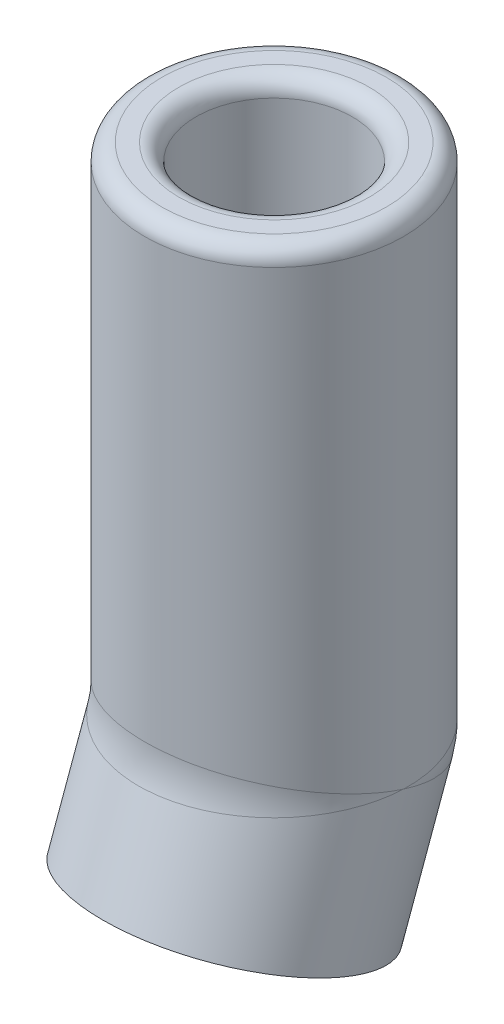
ISO-10303-21;
HEADER;
FILE_DESCRIPTION(('STEP AP214'),'2;1');
FILE_NAME('part.step','',(''),(''),'','','');
FILE_SCHEMA(('AUTOMOTIVE_DESIGN { 1 0 10303 214 1 1 1 1 }'));
ENDSEC;
DATA;
#1=APPLICATION_CONTEXT('core data for automotive mechanical design processes');
#2=APPLICATION_PROTOCOL_DEFINITION('international standard','automotive_design',2000,#1);
#3=PRODUCT_CONTEXT('',#1,'mechanical');
#4=PRODUCT('Part','Part','',(#3));
#5=PRODUCT_RELATED_PRODUCT_CATEGORY('part','',(#4));
#6=PRODUCT_DEFINITION_FORMATION('','',#4);
#7=PRODUCT_DEFINITION_CONTEXT('part definition',#1,'design');
#8=PRODUCT_DEFINITION('design','',#6,#7);
#9=PRODUCT_DEFINITION_SHAPE('','',#8);
#10=(LENGTH_UNIT() NAMED_UNIT(*) SI_UNIT(.MILLI.,.METRE.));
#11=(NAMED_UNIT(*) PLANE_ANGLE_UNIT() SI_UNIT($,.RADIAN.));
#12=(NAMED_UNIT(*) SI_UNIT($,.STERADIAN.) SOLID_ANGLE_UNIT());
#13=UNCERTAINTY_MEASURE_WITH_UNIT(LENGTH_MEASURE(1.E-05),#10,'distance_accuracy_value','');
#14=(GEOMETRIC_REPRESENTATION_CONTEXT(3) GLOBAL_UNCERTAINTY_ASSIGNED_CONTEXT((#13)) GLOBAL_UNIT_ASSIGNED_CONTEXT((#10,
#11,#12)) REPRESENTATION_CONTEXT('',''));
#15=CARTESIAN_POINT('',(0.,0.,0.));
#16=DIRECTION('',(0.,0.,1.));
#17=DIRECTION('',(1.,0.,0.));
#18=AXIS2_PLACEMENT_3D('',#15,#16,#17);
#19=CARTESIAN_POINT('',(0.,25.,0.));
#20=DIRECTION('',(0.,1.,0.));
#21=DIRECTION('',(0.,0.,1.));
#22=AXIS2_PLACEMENT_3D('',#19,#20,#21);
#23=PLANE('',#22);
#24=CARTESIAN_POINT('',(0.,25.,0.));
#25=DIRECTION('',(0.,1.,0.));
#26=DIRECTION('',(0.,0.,1.));
#27=AXIS2_PLACEMENT_3D('',#24,#25,#26);
#28=CIRCLE('',#27,5.575);
#29=CARTESIAN_POINT('',(0.,25.,5.575));
#30=VERTEX_POINT('',#29);
#31=EDGE_CURVE('E11',#30,#30,#28,.F.);
#32=ORIENTED_EDGE('',*,*,#31,.T.);
#33=EDGE_LOOP('',(#32));
#34=FACE_BOUND('',#33,.T.);
#35=CARTESIAN_POINT('',(0.,25.,0.));
#36=DIRECTION('',(0.,1.,0.));
#37=DIRECTION('',(0.,0.,1.));
#38=AXIS2_PLACEMENT_3D('',#35,#36,#37);
#39=CIRCLE('',#38,6.575);
#40=CARTESIAN_POINT('',(0.,25.,6.575));
#41=VERTEX_POINT('',#40);
#42=EDGE_CURVE('E75',#41,#41,#39,.T.);
#43=ORIENTED_EDGE('',*,*,#42,.T.);
#44=EDGE_LOOP('',(#43));
#45=FACE_BOUND('',#44,.T.);
#46=ADVANCED_FACE('F34',(#34,#45),#23,.T.);
#47=CARTESIAN_POINT('',(0.,25.,0.));
#48=DIRECTION('',(0.,-1.,0.));
#49=DIRECTION('',(0.,0.,-1.));
#50=AXIS2_PLACEMENT_3D('',#47,#48,#49);
#51=CYLINDRICAL_SURFACE('',#50,7.575);
#52=CARTESIAN_POINT('',(0.,24.,0.));
#53=DIRECTION('',(0.,1.,0.));
#54=DIRECTION('',(0.,0.,1.));
#55=AXIS2_PLACEMENT_3D('',#52,#53,#54);
#56=CIRCLE('',#55,7.575);
#57=CARTESIAN_POINT('',(0.,24.,7.575));
#58=VERTEX_POINT('',#57);
#59=EDGE_CURVE('E120',#58,#58,#56,.F.);
#60=ORIENTED_EDGE('',*,*,#59,.T.);
#61=EDGE_LOOP('',(#60));
#62=FACE_BOUND('',#61,.T.);
#63=CARTESIAN_POINT('',(0.,-4.,0.));
#64=DIRECTION('',(0.,0.953527218507654,-0.30130689266105));
#65=DIRECTION('',(0.,0.30130689266105,0.953527218507654));
#66=AXIS2_PLACEMENT_3D('',#63,#64,#65);
#67=ELLIPSE('',#66,7.94418853806343,7.575);
#68=CARTESIAN_POINT('',(-7.575,-4.,0.));
#69=VERTEX_POINT('',#68);
#70=CARTESIAN_POINT('',(7.575,-4.,0.));
#71=VERTEX_POINT('',#70);
#72=EDGE_CURVE('E48',#69,#71,#67,.T.);
#73=ORIENTED_EDGE('',*,*,#72,.T.);
#74=CARTESIAN_POINT('',(0.,-4.,0.));
#75=DIRECTION('',(0.,0.999328623934584,-0.0366374314739859));
#76=DIRECTION('',(0.,0.0366374314739859,0.999328623934584));
#77=AXIS2_PLACEMENT_3D('',#74,#75,#76);
#78=ELLIPSE('',#77,7.58008909038901,7.575);
#79=EDGE_CURVE('E54',#71,#69,#78,.T.);
#80=ORIENTED_EDGE('',*,*,#79,.T.);
#81=EDGE_LOOP('',(#73,#80));
#82=FACE_BOUND('',#81,.T.);
#83=ADVANCED_FACE('F90',(#62,#82),#51,.T.);
#84=CARTESIAN_POINT('',(0.,25.,0.));
#85=DIRECTION('',(0.,-1.,0.));
#86=DIRECTION('',(0.,0.,-1.));
#87=AXIS2_PLACEMENT_3D('',#84,#85,#86);
#88=CYLINDRICAL_SURFACE('',#87,4.575);
#89=CARTESIAN_POINT('',(0.,24.,0.));
#90=DIRECTION('',(0.,1.,0.));
#91=DIRECTION('',(0.,0.,1.));
#92=AXIS2_PLACEMENT_3D('',#89,#90,#91);
#93=CIRCLE('',#92,4.575);
#94=CARTESIAN_POINT('',(0.,24.,4.575));
#95=VERTEX_POINT('',#94);
#96=EDGE_CURVE('E42',#95,#95,#93,.T.);
#97=ORIENTED_EDGE('',*,*,#96,.T.);
#98=EDGE_LOOP('',(#97));
#99=FACE_BOUND('',#98,.T.);
#100=CARTESIAN_POINT('',(0.,0.,0.));
#101=DIRECTION('',(0.,1.,0.));
#102=DIRECTION('',(0.,0.,1.));
#103=AXIS2_PLACEMENT_3D('',#100,#101,#102);
#104=CIRCLE('',#103,4.575);
#105=CARTESIAN_POINT('',(0.,0.,4.575));
#106=VERTEX_POINT('',#105);
#107=EDGE_CURVE('E62',#106,#106,#104,.T.);
#108=ORIENTED_EDGE('',*,*,#107,.F.);
#109=EDGE_LOOP('',(#108));
#110=FACE_BOUND('',#109,.T.);
#111=ADVANCED_FACE('F103',(#99,#110),#88,.F.);
#112=CARTESIAN_POINT('',(0.,0.,0.));
#113=DIRECTION('',(0.,1.,0.));
#114=DIRECTION('',(0.,0.,1.));
#115=AXIS2_PLACEMENT_3D('',#112,#113,#114);
#116=PLANE('',#115);
#117=ORIENTED_EDGE('',*,*,#107,.T.);
#118=EDGE_LOOP('',(#117));
#119=FACE_BOUND('',#118,.T.);
#120=ADVANCED_FACE('F99',(#119),#116,.T.);
#121=CARTESIAN_POINT('',(0.,-12.,2.91176187412963));
#122=DIRECTION('',(0.,0.939692620785908,-0.34202014332567));
#123=DIRECTION('',(0.,0.34202014332567,0.939692620785908));
#124=AXIS2_PLACEMENT_3D('',#121,#122,#123);
#125=PLANE('',#124);
#126=CARTESIAN_POINT('',(0.,-12.,2.91176187412963));
#127=DIRECTION('',(0.,0.939692620785908,-0.34202014332567));
#128=DIRECTION('',(0.,0.34202014332567,0.939692620785908));
#129=AXIS2_PLACEMENT_3D('',#126,#127,#128);
#130=CIRCLE('',#129,7.575);
#131=CARTESIAN_POINT('',(0.,-9.40919741430805,10.0299334765829));
#132=VERTEX_POINT('',#131);
#133=EDGE_CURVE('E59',#132,#132,#130,.T.);
#134=ORIENTED_EDGE('',*,*,#133,.F.);
#135=EDGE_LOOP('',(#134));
#136=FACE_BOUND('',#135,.T.);
#137=ADVANCED_FACE('F89',(#136),#125,.F.);
#138=CARTESIAN_POINT('',(0.,-2.52539246041355,-0.536713251633989));
#139=DIRECTION('',(0.,-0.939692620785908,0.34202014332567));
#140=DIRECTION('',(0.,-0.34202014332567,-0.939692620785908));
#141=AXIS2_PLACEMENT_3D('',#138,#139,#140);
#142=CYLINDRICAL_SURFACE('',#141,7.575);
#143=CARTESIAN_POINT('',(0.,-4.,0.));
#144=DIRECTION('',(0.,0.951592473215281,-0.307362595186897));
#145=DIRECTION('',(0.,0.307362595186897,0.951592473215281));
#146=AXIS2_PLACEMENT_3D('',#143,#144,#145);
#147=ELLIPSE('',#146,7.58008909038901,7.575);
#148=EDGE_CURVE('E65',#69,#71,#147,.F.);
#149=ORIENTED_EDGE('',*,*,#148,.T.);
#150=CARTESIAN_POINT('',(0.,-4.,0.));
#151=DIRECTION('',(0.,0.999075517563099,-0.0429896523133944));
#152=DIRECTION('',(0.,0.0429896523133944,0.999075517563099));
#153=AXIS2_PLACEMENT_3D('',#150,#151,#152);
#154=ELLIPSE('',#153,7.94418853806343,7.575);
#155=EDGE_CURVE('E70',#71,#69,#154,.F.);
#156=ORIENTED_EDGE('',*,*,#155,.T.);
#157=EDGE_LOOP('',(#149,#156));
#158=FACE_BOUND('',#157,.T.);
#159=ORIENTED_EDGE('',*,*,#133,.T.);
#160=EDGE_LOOP('',(#159));
#161=FACE_BOUND('',#160,.T.);
#162=ADVANCED_FACE('F60',(#158,#161),#142,.T.);
#163=CARTESIAN_POINT('',(7.575,-4.,0.));
#164=CARTESIAN_POINT('',(7.575,-4.,0.));
#165=CARTESIAN_POINT('',(7.575,-4.,0.));
#166=CARTESIAN_POINT('',(7.57499888047834,-3.99254845607747,0.173173187046285));
#167=CARTESIAN_POINT('',(7.57500258805971,-3.97016092227507,0.169225819015982));
#168=CARTESIAN_POINT('',(7.57499888047834,-3.94777344258388,0.165278144105769));
#169=CARTESIAN_POINT('',(7.56958879430556,-3.98509901267392,0.34629755822542));
#170=CARTESIAN_POINT('',(7.56932976715222,-3.94032906793487,0.338410672181107));
#171=CARTESIAN_POINT('',(7.56958879430556,-3.89556160733533,0.330509697881582));
#172=CARTESIAN_POINT('',(7.54797794298695,-3.97023109430699,0.691826596916192));
#173=CARTESIAN_POINT('',(7.54669149111669,-3.88080903868768,0.675965531953642));
#174=CARTESIAN_POINT('',(7.54797794298695,-3.79135498917492,0.660285913377355));
#175=CARTESIAN_POINT('',(7.5317772402684,-3.9628126191647,0.864231268585723));
#176=CARTESIAN_POINT('',(7.52972416590204,-3.85111833677837,0.844349869903385));
#177=CARTESIAN_POINT('',(7.5317772402684,-3.73936020500911,0.824830579065649));
#178=CARTESIAN_POINT('',(7.46707427229843,-3.94065882772718,1.37908331914458));
#179=CARTESIAN_POINT('',(7.46199818780777,-3.76250100519663,1.34692373140557));
#180=CARTESIAN_POINT('',(7.46707427229843,-3.5840881872216,1.31621029469496));
#181=CARTESIAN_POINT('',(7.40247101058536,-3.92600974851794,1.71952655618521));
#182=CARTESIAN_POINT('',(7.39440259875741,-3.70396795867191,1.67888113400822));
#183=CARTESIAN_POINT('',(7.40247101058536,-3.481415374129,1.64113257250924));
#184=CARTESIAN_POINT('',(7.23138960627717,-3.89722176970849,2.38855650364788));
#185=CARTESIAN_POINT('',(7.21594240774403,-3.58921516826734,2.32967654798018));
#186=CARTESIAN_POINT('',(7.23138960627717,-3.27964550686328,2.27966114586317));
#187=CARTESIAN_POINT('',(7.12495279738831,-3.88308238151616,2.71715456890518));
#188=CARTESIAN_POINT('',(7.10506499158719,-3.53297733418534,2.6486171539841));
#189=CARTESIAN_POINT('',(7.12495279738831,-3.18054502823418,2.59327827856605));
#190=CARTESIAN_POINT('',(6.87199891375851,-3.85555037425999,3.3569958543959));
#191=CARTESIAN_POINT('',(6.84259641823819,-3.42383206405642,3.26761074016343));
#192=CARTESIAN_POINT('',(6.87199891375851,-2.98757804411899,3.20394891408365));
#193=CARTESIAN_POINT('',(6.725538033073,-3.84215673965581,3.66826267569223));
#194=CARTESIAN_POINT('',(6.69099141614657,-3.37090948481809,3.56774960164508));
#195=CARTESIAN_POINT('',(6.725538033073,-2.89370442088975,3.50102494197827));
#196=CARTESIAN_POINT('',(6.39503062930193,-3.81634751864779,4.26806656916211));
#197=CARTESIAN_POINT('',(6.350453747194,-3.26933472489361,4.14380869093684));
#198=CARTESIAN_POINT('',(6.39503062930193,-2.71281214180736,4.07348350805886));
#199=CARTESIAN_POINT('',(6.21104902897303,-3.80393029348706,4.55664172589337));
#200=CARTESIAN_POINT('',(6.16151176284947,-3.22067099957615,4.41979439160459));
#201=CARTESIAN_POINT('',(6.21104902897303,-2.62578200019609,4.34890239451054));
#202=CARTESIAN_POINT('',(5.80864087439418,-3.78028657951736,5.10611943739437));
#203=CARTESIAN_POINT('',(5.75033455111506,-3.12841825399868,4.94298571040794));
#204=CARTESIAN_POINT('',(5.80864087439418,-2.46006737809956,4.87332917173502));
#205=CARTESIAN_POINT('',(5.59028115272261,-3.76905784961791,5.3670740748986));
#206=CARTESIAN_POINT('',(5.52810059165778,-3.08482152922559,5.1902350230084));
#207=CARTESIAN_POINT('',(5.59028115272261,-2.38136719020618,5.12238677076719));
#208=CARTESIAN_POINT('',(5.12285355396729,-3.74798395327803,5.85682946392453));
#209=CARTESIAN_POINT('',(5.05483425638177,-3.00337004385396,5.65216935117739));
#210=CARTESIAN_POINT('',(5.12285355396729,-2.2336639667388,5.58981399287159));
#211=CARTESIAN_POINT('',(4.87384784205608,-3.73813606990637,6.08569335667505));
#212=CARTESIAN_POINT('',(4.80381931329707,-2.96551120330485,5.86687750529538));
#213=CARTESIAN_POINT('',(4.87384784205608,-2.1646418886729,5.80824387853581));
#214=CARTESIAN_POINT('',(4.34939589076599,-3.71999276863845,6.50734198905772));
#215=CARTESIAN_POINT('',(4.27775865631388,-2.89606211761869,6.26074284233635));
#216=CARTESIAN_POINT('',(4.34939589076599,-2.03747868931047,6.21066936145033));
#217=CARTESIAN_POINT('',(4.07400176540466,-3.7116943825297,6.70019570967185));
#218=CARTESIAN_POINT('',(4.00275068911941,-2.86447079732678,6.43990612276558));
#219=CARTESIAN_POINT('',(4.07400176540466,-1.97931676433596,6.39473079480882));
#220=CARTESIAN_POINT('',(3.50149734168551,-3.69679224911782,7.04651990282262));
#221=CARTESIAN_POINT('',(3.43358242764209,-2.8079519489975,6.76044043976119));
#222=CARTESIAN_POINT('',(3.50149734168551,-1.8748703389585,6.72526591331762));
#223=CARTESIAN_POINT('',(3.20442571026539,-3.6901855748137,7.20005839858991));
#224=CARTESIAN_POINT('',(3.13948211612153,-2.78302543130898,6.90180574635445));
#225=CARTESIAN_POINT('',(3.20442571026539,-1.82856532372168,6.87180452048912));
#226=CARTESIAN_POINT('',(2.59366442246287,-3.67877976840643,7.46512827765048));
#227=CARTESIAN_POINT('',(2.53699896151311,-2.74011513914118,7.14516210620017));
#228=CARTESIAN_POINT('',(2.59366442246287,-1.74862403780909,7.12478974537711));
#229=CARTESIAN_POINT('',(2.27999908739741,-3.67397807014202,7.57671929829256));
#230=CARTESIAN_POINT('',(2.22869754053759,-2.72213339899897,7.24714162215379));
#231=CARTESIAN_POINT('',(2.27999908739741,-1.71496978136154,7.23129328154904));
#232=CARTESIAN_POINT('',(1.64143266568392,-3.66626390888283,7.7559956877922));
#233=CARTESIAN_POINT('',(1.60260785167663,-2.69329399138388,7.4106980302498));
#234=CARTESIAN_POINT('',(1.64143266568392,-1.66090258534078,7.40239638038249));
#235=CARTESIAN_POINT('',(1.31654326868554,-3.66334953924308,7.82372536690133));
#236=CARTESIAN_POINT('',(1.28491884763783,-2.68243836129969,7.47226336778674));
#237=CARTESIAN_POINT('',(1.31654326868554,-1.64047628242918,7.46703823317143));
#238=CARTESIAN_POINT('',(0.661100540295204,-3.6594591413318,7.91413785217591));
#239=CARTESIAN_POINT('',(0.64476504614048,-2.66795230677787,7.55441786543433));
#240=CARTESIAN_POINT('',(0.661100540295204,-1.61320916946629,7.55332877286209));
#241=CARTESIAN_POINT('',(0.330550270147602,-3.6584820968366,7.93684427528455));
#242=CARTESIAN_POINT('',(0.322411325383715,-2.66432312113337,7.575));
#243=CARTESIAN_POINT('',(0.330550270147602,-1.60636123688258,7.575));
#244=CARTESIAN_POINT('',(-0.330550270147602,-3.6584820968366,7.93684427528455));
#245=CARTESIAN_POINT('',(-0.322411325383714,-2.66432312113337,7.575));
#246=CARTESIAN_POINT('',(-0.330550270147602,-1.60636123688258,7.575));
#247=CARTESIAN_POINT('',(-0.661100540295203,-3.6594591413318,7.91413785217591));
#248=CARTESIAN_POINT('',(-0.644765046140479,-2.66795230677787,7.55441786543433));
#249=CARTESIAN_POINT('',(-0.661100540295203,-1.61320916946629,7.55332877286209));
#250=CARTESIAN_POINT('',(-1.31654326868554,-3.66334953924308,7.82372536690133));
#251=CARTESIAN_POINT('',(-1.28491884763782,-2.68243836129969,7.47226336778674));
#252=CARTESIAN_POINT('',(-1.31654326868554,-1.64047628242918,7.46703823317144));
#253=CARTESIAN_POINT('',(-1.64143266568391,-3.66626390888283,7.7559956877922));
#254=CARTESIAN_POINT('',(-1.60260785167662,-2.69329399138388,7.4106980302498));
#255=CARTESIAN_POINT('',(-1.64143266568391,-1.66090258534078,7.40239638038249));
#256=CARTESIAN_POINT('',(-2.27999908739741,-3.67397807014202,7.57671929829256));
#257=CARTESIAN_POINT('',(-2.22869754053758,-2.72213339899897,7.24714162215379));
#258=CARTESIAN_POINT('',(-2.27999908739741,-1.71496978136154,7.23129328154904));
#259=CARTESIAN_POINT('',(-2.59366442246287,-3.67877976840643,7.46512827765048));
#260=CARTESIAN_POINT('',(-2.53699896151311,-2.74011513914118,7.14516210620017));
#261=CARTESIAN_POINT('',(-2.59366442246287,-1.74862403780909,7.12478974537711));
#262=CARTESIAN_POINT('',(-3.20442571026539,-3.6901855748137,7.20005839858991));
#263=CARTESIAN_POINT('',(-3.13948211612153,-2.78302543130898,6.90180574635445));
#264=CARTESIAN_POINT('',(-3.20442571026539,-1.82856532372168,6.87180452048912));
#265=CARTESIAN_POINT('',(-3.50149734168551,-3.69679224911782,7.04651990282262));
#266=CARTESIAN_POINT('',(-3.43358242764209,-2.8079519489975,6.76044043976119));
#267=CARTESIAN_POINT('',(-3.50149734168551,-1.8748703389585,6.72526591331763));
#268=CARTESIAN_POINT('',(-4.07400176540466,-3.7116943825297,6.70019570967185));
#269=CARTESIAN_POINT('',(-4.00275068911941,-2.86447079732678,6.43990612276558));
#270=CARTESIAN_POINT('',(-4.07400176540466,-1.97931676433596,6.39473079480883));
#271=CARTESIAN_POINT('',(-4.34939589076599,-3.71999276863846,6.50734198905772));
#272=CARTESIAN_POINT('',(-4.27775865631388,-2.89606211761869,6.26074284233635));
#273=CARTESIAN_POINT('',(-4.34939589076599,-2.03747868931046,6.21066936145033));
#274=CARTESIAN_POINT('',(-4.87384784205608,-3.73813606990637,6.08569335667505));
#275=CARTESIAN_POINT('',(-4.80381931329707,-2.96551120330485,5.86687750529539));
#276=CARTESIAN_POINT('',(-4.87384784205608,-2.1646418886729,5.80824387853581));
#277=CARTESIAN_POINT('',(-5.12285355396729,-3.74798395327803,5.85682946392453));
#278=CARTESIAN_POINT('',(-5.05483425638177,-3.00337004385396,5.65216935117739));
#279=CARTESIAN_POINT('',(-5.12285355396729,-2.2336639667388,5.58981399287159));
#280=CARTESIAN_POINT('',(-5.5902811527226,-3.76905784961791,5.3670740748986));
#281=CARTESIAN_POINT('',(-5.52810059165778,-3.08482152922559,5.1902350230084));
#282=CARTESIAN_POINT('',(-5.5902811527226,-2.38136719020617,5.12238677076719));
#283=CARTESIAN_POINT('',(-5.80864087439417,-3.78028657951736,5.10611943739437));
#284=CARTESIAN_POINT('',(-5.75033455111506,-3.12841825399868,4.94298571040795));
#285=CARTESIAN_POINT('',(-5.80864087439417,-2.46006737809955,4.87332917173503));
#286=CARTESIAN_POINT('',(-6.21104902897303,-3.80393029348706,4.55664172589337));
#287=CARTESIAN_POINT('',(-6.16151176284946,-3.22067099957615,4.41979439160459));
#288=CARTESIAN_POINT('',(-6.21104902897303,-2.62578200019609,4.34890239451054));
#289=CARTESIAN_POINT('',(-6.39503062930193,-3.81634751864779,4.26806656916211));
#290=CARTESIAN_POINT('',(-6.35045374719399,-3.26933472489361,4.14380869093685));
#291=CARTESIAN_POINT('',(-6.39503062930193,-2.71281214180736,4.07348350805886));
#292=CARTESIAN_POINT('',(-6.725538033073,-3.84215673965582,3.66826267569224));
#293=CARTESIAN_POINT('',(-6.69099141614657,-3.37090948481809,3.56774960164508));
#294=CARTESIAN_POINT('',(-6.725538033073,-2.89370442088975,3.50102494197827));
#295=CARTESIAN_POINT('',(-6.87199891375851,-3.85555037426,3.3569958543959));
#296=CARTESIAN_POINT('',(-6.84259641823819,-3.42383206405643,3.26761074016343));
#297=CARTESIAN_POINT('',(-6.87199891375851,-2.987578044119,3.20394891408365));
#298=CARTESIAN_POINT('',(-7.12495279738831,-3.88308238151616,2.71715456890519));
#299=CARTESIAN_POINT('',(-7.10506499158718,-3.53297733418533,2.6486171539841));
#300=CARTESIAN_POINT('',(-7.12495279738831,-3.18054502823417,2.59327827856606));
#301=CARTESIAN_POINT('',(-7.23138960627716,-3.89722176970848,2.38855650364788));
#302=CARTESIAN_POINT('',(-7.21594240774403,-3.58921516826733,2.32967654798018));
#303=CARTESIAN_POINT('',(-7.23138960627716,-3.27964550686327,2.27966114586317));
#304=CARTESIAN_POINT('',(-7.40247101058536,-3.92600974851795,1.71952655618522));
#305=CARTESIAN_POINT('',(-7.39440259875741,-3.70396795867192,1.67888113400823));
#306=CARTESIAN_POINT('',(-7.40247101058536,-3.48141537412901,1.64113257250925));
#307=CARTESIAN_POINT('',(-7.46707427229843,-3.94065882772722,1.3790833191446));
#308=CARTESIAN_POINT('',(-7.46199818780777,-3.76250100519667,1.34692373140558));
#309=CARTESIAN_POINT('',(-7.46707427229843,-3.58408818722164,1.31621029469497));
#310=CARTESIAN_POINT('',(-7.5317772402684,-3.96281261916468,0.864231268585721));
#311=CARTESIAN_POINT('',(-7.52972416590203,-3.85111833677835,0.844349869903384));
#312=CARTESIAN_POINT('',(-7.5317772402684,-3.73936020500909,0.824830579065649));
#313=CARTESIAN_POINT('',(-7.54797794298695,-3.97023109430693,0.69182659691618));
#314=CARTESIAN_POINT('',(-7.54669149111669,-3.88080903868762,0.675965531953634));
#315=CARTESIAN_POINT('',(-7.54797794298695,-3.79135498917486,0.660285913377352));
#316=CARTESIAN_POINT('',(-7.56958879430556,-3.98509901267383,0.3462975582254));
#317=CARTESIAN_POINT('',(-7.56932976715222,-3.94032906793478,0.338410672181094));
#318=CARTESIAN_POINT('',(-7.56958879430556,-3.89556160733524,0.330509697881575));
#319=CARTESIAN_POINT('',(-7.57499888047834,-3.99254845607739,0.173173187046268));
#320=CARTESIAN_POINT('',(-7.57500258805971,-3.97016092227499,0.16922581901597));
#321=CARTESIAN_POINT('',(-7.57499888047834,-3.9477734425838,0.165278144105763));
#322=CARTESIAN_POINT('',(-7.575,-4.,0.));
#323=CARTESIAN_POINT('',(-7.575,-4.,0.));
#324=CARTESIAN_POINT('',(-7.575,-4.,0.));
#325=(BOUNDED_SURFACE() B_SPLINE_SURFACE(3,2,((#163,#164,#165),(#166,#167,#168),(#169,#170,
#171),(#172,#173,#174),(#175,#176,#177),(#178,#179,#180),(#181,#182,#183),(#184,#185,#186),
(#187,#188,#189),(#190,#191,#192),(#193,#194,#195),(#196,#197,#198),(#199,#200,#201),(#202,#203,
#204),(#205,#206,#207),(#208,#209,#210),(#211,#212,#213),(#214,#215,#216),(#217,#218,#219),
(#220,#221,#222),(#223,#224,#225),(#226,#227,#228),(#229,#230,#231),(#232,#233,#234),(#235,#236,
#237),(#238,#239,#240),(#241,#242,#243),(#244,#245,#246),(#247,#248,#249),(#250,#251,#252),
(#253,#254,#255),(#256,#257,#258),(#259,#260,#261),(#262,#263,#264),(#265,#266,#267),(#268,#269,
#270),(#271,#272,#273),(#274,#275,#276),(#277,#278,#279),(#280,#281,#282),(#283,#284,#285),
(#286,#287,#288),(#289,#290,#291),(#292,#293,#294),(#295,#296,#297),(#298,#299,#300),(#301,#302,
#303),(#304,#305,#306),(#307,#308,#309),(#310,#311,#312),(#313,#314,#315),(#316,#317,#318),
(#319,#320,#321),(#322,#323,#324)),.UNSPECIFIED.,.F.,.F.,.F.) B_SPLINE_SURFACE_WITH_KNOTS((4,2,
2,2,2,2,2,2,2,2,2,2,2,2,2,2,2,2,2,2,2,2,2,2,2,2,4),(3,3),(0.,0.901956910311366,1.80390860254944,
3.6059615583114,5.40623845068466,7.20400061479368,8.99867807780822,10.789908737092,
12.5775640009625,14.3617588952914,16.1428455912442,17.9213904256492,19.6981356977216,
21.4739487314751,23.2497617652285,25.0265070373009,26.8050518717059,28.5861385676587,
30.3703334619877,32.1579887258581,33.9492193851419,35.7438968481565,37.5416590122655,
39.3419359046387,41.1439888604007,42.0459405526388,42.9478974629501),(0.,1.),
.UNSPECIFIED.) GEOMETRIC_REPRESENTATION_ITEM() RATIONAL_B_SPLINE_SURFACE(((1.,1.,1.),(1.,
1.00000006701755,1.),(1.,0.999978450902769,1.),(1.,0.999892576529652,1.),(1.,0.999828318518011,
1.),(1.,0.999572842255244,1.),(1.,0.999318918854911,1.),(1.,0.998660470541519,1.),(1.,
0.998256094304618,1.),(1.,0.997323765861636,1.),(1.,0.996795987062458,1.),(1.,0.995652311813626,
1.),(1.,0.995036568115042,1.),(1.,0.993758596084939,1.),(1.,0.993096459301637,1.),(1.,
0.991770760016961,1.),(1.,0.991107202999509,1.),(1.,0.989824105067995,1.),(1.,0.989204481438143,
1.),(1.,0.988051926982961,1.),(1.,0.987518847012851,1.),(1.,0.986576267571039,1.),(1.,
0.986166592818301,1.),(1.,0.985499258773441,1.),(1.,0.98524144608887,1.),(1.,0.984895737749545,
1.),(1.,0.984807753012208,1.),(1.,0.984807753012208,1.),(1.,0.984895737749545,1.),(1.,
0.985241446088869,1.),(1.,0.985499258773442,1.),(1.,0.986166592818301,1.),(1.,0.986576267571039,
1.),(1.,0.987518847012851,1.),(1.,0.98805192698296,1.),(1.,0.989204481438143,1.),(1.,
0.989824105067995,1.),(1.,0.991107202999509,1.),(1.,0.991770760016961,1.),(1.,0.993096459301637,
1.),(1.,0.993758596084939,1.),(1.,0.995036568115043,1.),(1.,0.995652311813626,1.),(1.,
0.996795987062458,1.),(1.,0.997323765861636,1.),(1.,0.998256094304618,1.),(1.,0.998660470541519,
1.),(1.,0.999318918854912,1.),(1.,0.999572842255244,1.),(1.,0.999828318518011,1.),(1.,
0.999892576529652,1.),(1.,0.999978450902769,1.),(1.,1.00000006701755,1.),(1.,1.,1.))) REPRESENTATION_ITEM('') SURFACE());
#326=ORIENTED_EDGE('',*,*,#155,.F.);
#327=ORIENTED_EDGE('',*,*,#72,.F.);
#328=EDGE_LOOP('',(#326,#327));
#329=FACE_BOUND('',#328,.T.);
#330=ADVANCED_FACE('F81',(#329),#325,.F.);
#331=CARTESIAN_POINT('',(-7.575,-4.,0.));
#332=CARTESIAN_POINT('',(-7.575,-4.,0.));
#333=CARTESIAN_POINT('',(-7.575,-4.,0.));
#334=CARTESIAN_POINT('',(-7.57499888047834,-4.00605943483834,-0.165278144105766));
#335=CARTESIAN_POINT('',(-7.57499744183442,-4.02844693377994,-0.16133057837008));
#336=CARTESIAN_POINT('',(-7.57499888047834,-4.05083444833192,-0.157383101165255));
#337=CARTESIAN_POINT('',(-7.56958879430556,-4.01211716157989,-0.330509697881578));
#338=CARTESIAN_POINT('',(-7.56984734228634,-4.05688709949602,-0.322622773142559));
#339=CARTESIAN_POINT('',(-7.56958879430556,-4.10165456691848,-0.314721837537748));
#340=CARTESIAN_POINT('',(-7.54797794298695,-4.02420743219518,-0.660285913377355));
#341=CARTESIAN_POINT('',(-7.54926301805584,-4.11366399817617,-0.644620566401564));
#342=CARTESIAN_POINT('',(-7.54797794298695,-4.20308353732725,-0.628745229838521));
#343=CARTESIAN_POINT('',(-7.5317772402684,-4.03023997621441,-0.824830579065652));
#344=CARTESIAN_POINT('',(-7.53382709167157,-4.14200314437274,-0.805339851009663));
#345=CARTESIAN_POINT('',(-7.5317772402684,-4.25369239037,-0.785429889545576));
#346=CARTESIAN_POINT('',(-7.46707427229843,-4.04825496170356,-1.31621029469497));
#347=CARTESIAN_POINT('',(-7.47213475577845,-4.22668723098142,-1.28560717180444));
#348=CARTESIAN_POINT('',(-7.46707427229843,-4.40482560220914,-1.25333727024533));
#349=CARTESIAN_POINT('',(-7.40247101058536,-4.06016727703475,-1.64113257250925));
#350=CARTESIAN_POINT('',(-7.41048212506948,-4.28275709501414,-1.60359517232164));
#351=CARTESIAN_POINT('',(-7.40247101058536,-4.50476165142369,-1.56273858883327));
#352=CARTESIAN_POINT('',(-7.23138960627716,-4.08357704064017,-2.27966114586317));
#353=CARTESIAN_POINT('',(-7.24678133967733,-4.39318367819222,-2.22985544590196));
#354=CARTESIAN_POINT('',(-7.23138960627717,-4.70115330348538,-2.17076578807845));
#355=CARTESIAN_POINT('',(-7.12495279738831,-4.09507488622697,-2.59327827856606));
#356=CARTESIAN_POINT('',(-7.14472166104233,-4.44755763786963,-2.53822549488108));
#357=CARTESIAN_POINT('',(-7.12495279738831,-4.79761223950896,-2.46940198822693));
#358=CARTESIAN_POINT('',(-6.87199891375851,-4.11746332084807,-3.20394891408365));
#359=CARTESIAN_POINT('',(-6.90128399264151,-4.55376750849578,-3.14057160322715));
#360=CARTESIAN_POINT('',(-6.87199891375851,-4.98543565098907,-3.05090197377139));
#361=CARTESIAN_POINT('',(-6.725538033073,-4.12835473569787,-3.50102494197827));
#362=CARTESIAN_POINT('',(-6.7598938829413,-4.60561782980314,-3.4346293877989));
#363=CARTESIAN_POINT('',(-6.725538033073,-5.07680705446393,-3.33378720826431));
#364=CARTESIAN_POINT('',(-6.39503062930193,-4.14934223769086,-4.07348350805886));
#365=CARTESIAN_POINT('',(-6.43941885216839,-4.70592267062317,-4.00348640796114));
#366=CARTESIAN_POINT('',(-6.39503062930193,-5.25287761453129,-3.87890044695561));
#367=CARTESIAN_POINT('',(-6.21104902897303,-4.15943965743581,-4.34890239451054));
#368=CARTESIAN_POINT('',(-6.26032662282199,-4.75438812314835,-4.27834764774676));
#369=CARTESIAN_POINT('',(-6.21104902897303,-5.33758795072677,-4.14116306312771));
#370=CARTESIAN_POINT('',(-5.80864087439417,-4.1786662158006,-4.87332917173503));
#371=CARTESIAN_POINT('',(-5.866689705678,-4.84707646598293,-4.80400936135502));
#372=CARTESIAN_POINT('',(-5.80864087439418,-5.49888541721841,-4.64053890607568));
#373=CARTESIAN_POINT('',(-5.5902811527226,-4.1877971768269,-5.1223867707672));
#374=CARTESIAN_POINT('',(-5.6521485113197,-4.89130655197085,-5.05485064389842));
#375=CARTESIAN_POINT('',(-5.59028115272261,-5.57548783623863,-4.87769946663578));
#376=CARTESIAN_POINT('',(-5.12285355396729,-4.20493401490875,-5.58981399287159));
#377=CARTESIAN_POINT('',(-5.19056166072777,-4.97469515306906,-5.52777090127007));
#378=CARTESIAN_POINT('',(-5.12285355396729,-5.71925400144798,-5.32279852181864));
#379=CARTESIAN_POINT('',(-4.87384784205608,-4.21294210131419,-5.80824387853581));
#380=CARTESIAN_POINT('',(-4.94353593004496,-5.01385731111581,-5.74987053621757));
#381=CARTESIAN_POINT('',(-4.87384784205608,-5.78643628254766,-5.53079440039657));
#382=CARTESIAN_POINT('',(-4.34939589076599,-4.22769584267668,-6.21066936145033));
#383=CARTESIAN_POINT('',(-4.42069416486756,-5.08632529883717,-6.16085691748604));
#384=CARTESIAN_POINT('',(-4.349395890766,-5.91020992200467,-5.91399673384294));
#385=CARTESIAN_POINT('',(-4.07400176540466,-4.23444391132013,-6.39473079480883));
#386=CARTESIAN_POINT('',(-4.14491879467707,-5.11963181099084,-6.34974753433802));
#387=CARTESIAN_POINT('',(-4.07400176540466,-5.96682152951387,-6.0892658799458));
#388=CARTESIAN_POINT('',(-3.5014973416855,-4.24656200487222,-6.72526591331763));
#389=CARTESIAN_POINT('',(-3.56907887028928,-5.17967769430028,-6.69028466069371));
#390=CARTESIAN_POINT('',(-3.50149734168551,-6.06848391503153,-6.40401192381263));
#391=CARTESIAN_POINT('',(-3.20442571026539,-4.25193440995494,-6.87180452048912));
#392=CARTESIAN_POINT('',(-3.26907783846258,-5.20641569612657,-6.84192340434407));
#393=CARTESIAN_POINT('',(-3.2044257102654,-6.11355466104696,-6.54355064238833));
#394=CARTESIAN_POINT('',(-2.59366442246287,-4.26120936577905,-7.12478974537711));
#395=CARTESIAN_POINT('',(-2.65003810404451,-5.25272188691422,-7.1045388622938));
#396=CARTESIAN_POINT('',(-2.59366442246287,-6.19136509637639,-6.78445121310374));
#397=CARTESIAN_POINT('',(-2.27999908739741,-4.26511400326744,-7.23129328154904));
#398=CARTESIAN_POINT('',(-2.33108512444289,-5.27228772807184,-7.21550226153656));
#399=CARTESIAN_POINT('',(-2.27999908739741,-6.22412229204792,-6.88586726480552));
#400=CARTESIAN_POINT('',(-1.64143266568392,-4.27138699286101,-7.40239638038249));
#401=CARTESIAN_POINT('',(-1.6800407287638,-5.30378871456272,-7.39415323352231));
#402=CARTESIAN_POINT('',(-1.64143266568392,-6.27674831640306,-7.04879707297279));
#403=CARTESIAN_POINT('',(-1.31654326868554,-4.27375689540877,-7.46703823317144));
#404=CARTESIAN_POINT('',(-1.3480536304797,-5.31572158390065,-7.46182789845438));
#405=CARTESIAN_POINT('',(-1.31654326868555,-6.29663015222267,-7.11035109944154));
#406=CARTESIAN_POINT('',(-0.661100540295206,-4.27692048310059,-7.55332877286209));
#407=CARTESIAN_POINT('',(-0.677320067235846,-5.33166635058449,-7.55225516386648));
#408=CARTESIAN_POINT('',(-0.661100540295206,-6.32317045496609,-7.19251969354826));
#409=CARTESIAN_POINT('',(-0.330550270147603,-4.27771499461583,-7.575));
#410=CARTESIAN_POINT('',(-0.338690290197457,-5.33567687886662,-7.575));
#411=CARTESIAN_POINT('',(-0.330550270147603,-6.32983585456985,-7.21315572471545));
#412=CARTESIAN_POINT('',(0.330550270147601,-4.27771499461583,-7.575));
#413=CARTESIAN_POINT('',(0.338690290197455,-5.33567687886662,-7.575));
#414=CARTESIAN_POINT('',(0.330550270147602,-6.32983585456985,-7.21315572471545));
#415=CARTESIAN_POINT('',(0.661100540295204,-4.27692048310059,-7.55332877286209));
#416=CARTESIAN_POINT('',(0.677320067235844,-5.33166635058449,-7.55225516386648));
#417=CARTESIAN_POINT('',(0.661100540295204,-6.32317045496609,-7.19251969354826));
#418=CARTESIAN_POINT('',(1.31654326868554,-4.27375689540877,-7.46703823317144));
#419=CARTESIAN_POINT('',(1.3480536304797,-5.31572158390065,-7.46182789845438));
#420=CARTESIAN_POINT('',(1.31654326868554,-6.29663015222267,-7.11035109944154));
#421=CARTESIAN_POINT('',(1.64143266568391,-4.27138699286101,-7.40239638038249));
#422=CARTESIAN_POINT('',(1.6800407287638,-5.30378871456272,-7.3941532335223));
#423=CARTESIAN_POINT('',(1.64143266568392,-6.27674831640306,-7.04879707297279));
#424=CARTESIAN_POINT('',(2.27999908739741,-4.26511400326744,-7.23129328154904));
#425=CARTESIAN_POINT('',(2.33108512444289,-5.27228772807184,-7.21550226153656));
#426=CARTESIAN_POINT('',(2.27999908739741,-6.22412229204792,-6.88586726480553));
#427=CARTESIAN_POINT('',(2.59366442246287,-4.26120936577905,-7.12478974537711));
#428=CARTESIAN_POINT('',(2.65003810404451,-5.25272188691422,-7.1045388622938));
#429=CARTESIAN_POINT('',(2.59366442246287,-6.19136509637639,-6.78445121310374));
#430=CARTESIAN_POINT('',(3.20442571026539,-4.25193440995494,-6.87180452048912));
#431=CARTESIAN_POINT('',(3.26907783846258,-5.20641569612657,-6.84192340434407));
#432=CARTESIAN_POINT('',(3.20442571026539,-6.11355466104696,-6.54355064238833));
#433=CARTESIAN_POINT('',(3.5014973416855,-4.24656200487222,-6.72526591331763));
#434=CARTESIAN_POINT('',(3.56907887028927,-5.17967769430028,-6.69028466069371));
#435=CARTESIAN_POINT('',(3.50149734168551,-6.06848391503153,-6.40401192381263));
#436=CARTESIAN_POINT('',(4.07400176540466,-4.23444391132013,-6.39473079480883));
#437=CARTESIAN_POINT('',(4.14491879467707,-5.11963181099084,-6.34974753433802));
#438=CARTESIAN_POINT('',(4.07400176540466,-5.96682152951387,-6.0892658799458));
#439=CARTESIAN_POINT('',(4.34939589076599,-4.22769584267668,-6.21066936145033));
#440=CARTESIAN_POINT('',(4.42069416486756,-5.08632529883717,-6.16085691748604));
#441=CARTESIAN_POINT('',(4.34939589076599,-5.91020992200467,-5.91399673384294));
#442=CARTESIAN_POINT('',(4.87384784205608,-4.21294210131419,-5.80824387853581));
#443=CARTESIAN_POINT('',(4.94353593004496,-5.01385731111581,-5.74987053621757));
#444=CARTESIAN_POINT('',(4.87384784205608,-5.78643628254766,-5.53079440039658));
#445=CARTESIAN_POINT('',(5.12285355396729,-4.20493401490876,-5.58981399287159));
#446=CARTESIAN_POINT('',(5.19056166072777,-4.97469515306906,-5.52777090127008));
#447=CARTESIAN_POINT('',(5.12285355396729,-5.71925400144798,-5.32279852181864));
#448=CARTESIAN_POINT('',(5.5902811527226,-4.18779717682691,-5.1223867707672));
#449=CARTESIAN_POINT('',(5.6521485113197,-4.89130655197085,-5.05485064389843));
#450=CARTESIAN_POINT('',(5.5902811527226,-5.57548783623863,-4.87769946663579));
#451=CARTESIAN_POINT('',(5.80864087439417,-4.1786662158006,-4.87332917173503));
#452=CARTESIAN_POINT('',(5.866689705678,-4.84707646598293,-4.80400936135502));
#453=CARTESIAN_POINT('',(5.80864087439417,-5.49888541721841,-4.64053890607568));
#454=CARTESIAN_POINT('',(6.21104902897303,-4.15943965743581,-4.34890239451055));
#455=CARTESIAN_POINT('',(6.26032662282199,-4.75438812314835,-4.27834764774676));
#456=CARTESIAN_POINT('',(6.21104902897303,-5.33758795072677,-4.14116306312772));
#457=CARTESIAN_POINT('',(6.39503062930193,-4.14934223769086,-4.07348350805887));
#458=CARTESIAN_POINT('',(6.43941885216838,-4.70592267062317,-4.00348640796114));
#459=CARTESIAN_POINT('',(6.39503062930193,-5.25287761453129,-3.87890044695561));
#460=CARTESIAN_POINT('',(6.725538033073,-4.12835473569787,-3.50102494197828));
#461=CARTESIAN_POINT('',(6.7598938829413,-4.60561782980314,-3.4346293877989));
#462=CARTESIAN_POINT('',(6.725538033073,-5.07680705446393,-3.33378720826431));
#463=CARTESIAN_POINT('',(6.87199891375851,-4.11746332084807,-3.20394891408365));
#464=CARTESIAN_POINT('',(6.90128399264151,-4.55376750849578,-3.14057160322715));
#465=CARTESIAN_POINT('',(6.87199891375851,-4.98543565098907,-3.0509019737714));
#466=CARTESIAN_POINT('',(7.12495279738831,-4.09507488622697,-2.59327827856606));
#467=CARTESIAN_POINT('',(7.14472166104233,-4.44755763786963,-2.53822549488108));
#468=CARTESIAN_POINT('',(7.12495279738831,-4.79761223950896,-2.46940198822693));
#469=CARTESIAN_POINT('',(7.23138960627716,-4.08357704064017,-2.27966114586317));
#470=CARTESIAN_POINT('',(7.24678133967733,-4.39318367819222,-2.22985544590196));
#471=CARTESIAN_POINT('',(7.23138960627717,-4.70115330348538,-2.17076578807845));
#472=CARTESIAN_POINT('',(7.40247101058536,-4.06016727703475,-1.64113257250925));
#473=CARTESIAN_POINT('',(7.41048212506948,-4.28275709501414,-1.60359517232164));
#474=CARTESIAN_POINT('',(7.40247101058536,-4.50476165142369,-1.56273858883327));
#475=CARTESIAN_POINT('',(7.46707427229843,-4.04825496170356,-1.31621029469497));
#476=CARTESIAN_POINT('',(7.47213475577845,-4.22668723098142,-1.28560717180444));
#477=CARTESIAN_POINT('',(7.46707427229843,-4.40482560220914,-1.25333727024533));
#478=CARTESIAN_POINT('',(7.5317772402684,-4.03023997621441,-0.824830579065652));
#479=CARTESIAN_POINT('',(7.53382709167157,-4.14200314437274,-0.805339851009663));
#480=CARTESIAN_POINT('',(7.5317772402684,-4.25369239037,-0.785429889545576));
#481=CARTESIAN_POINT('',(7.54797794298695,-4.02420743219518,-0.660285913377355));
#482=CARTESIAN_POINT('',(7.54926301805584,-4.11366399817617,-0.644620566401564));
#483=CARTESIAN_POINT('',(7.54797794298695,-4.20308353732725,-0.628745229838522));
#484=CARTESIAN_POINT('',(7.56958879430556,-4.01211716157989,-0.330509697881579));
#485=CARTESIAN_POINT('',(7.56984734228634,-4.05688709949602,-0.32262277314256));
#486=CARTESIAN_POINT('',(7.56958879430556,-4.10165456691848,-0.31472183753775));
#487=CARTESIAN_POINT('',(7.57499888047834,-4.00605943483834,-0.165278144105768));
#488=CARTESIAN_POINT('',(7.57499744183442,-4.02844693377994,-0.161330578370082));
#489=CARTESIAN_POINT('',(7.57499888047834,-4.05083444833192,-0.157383101165258));
#490=CARTESIAN_POINT('',(7.575,-4.,0.));
#491=CARTESIAN_POINT('',(7.575,-4.,0.));
#492=CARTESIAN_POINT('',(7.575,-4.,0.));
#493=(BOUNDED_SURFACE() B_SPLINE_SURFACE(3,2,((#331,#332,#333),(#334,#335,#336),(#337,#338,
#339),(#340,#341,#342),(#343,#344,#345),(#346,#347,#348),(#349,#350,#351),(#352,#353,#354),
(#355,#356,#357),(#358,#359,#360),(#361,#362,#363),(#364,#365,#366),(#367,#368,#369),(#370,#371,
#372),(#373,#374,#375),(#376,#377,#378),(#379,#380,#381),(#382,#383,#384),(#385,#386,#387),
(#388,#389,#390),(#391,#392,#393),(#394,#395,#396),(#397,#398,#399),(#400,#401,#402),(#403,#404,
#405),(#406,#407,#408),(#409,#410,#411),(#412,#413,#414),(#415,#416,#417),(#418,#419,#420),
(#421,#422,#423),(#424,#425,#426),(#427,#428,#429),(#430,#431,#432),(#433,#434,#435),(#436,#437,
#438),(#439,#440,#441),(#442,#443,#444),(#445,#446,#447),(#448,#449,#450),(#451,#452,#453),
(#454,#455,#456),(#457,#458,#459),(#460,#461,#462),(#463,#464,#465),(#466,#467,#468),(#469,#470,
#471),(#472,#473,#474),(#475,#476,#477),(#478,#479,#480),(#481,#482,#483),(#484,#485,#486),
(#487,#488,#489),(#490,#491,#492)),.UNSPECIFIED.,.F.,.F.,.F.) B_SPLINE_SURFACE_WITH_KNOTS((4,2,
2,2,2,2,2,2,2,2,2,2,2,2,2,2,2,2,2,2,2,2,2,2,2,2,4),(3,3),(0.,0.104646934345518,
0.209293263279217,0.418371230522317,0.627243135162309,0.835823275749542,1.04404552283963,
1.25186786452449,1.45927538132714,1.66628141879072,1.8729268365532,2.0792773422024,
2.28541905885168,2.49145261525401,2.69748617165635,2.90362788830563,3.10997839395483,
3.31662381171731,3.52362984918089,3.73103736598354,3.9388597076684,4.14708195475848,
4.35566209534572,4.56453399998571,4.77361196722881,4.87825829616251,4.98290523050803),(0.,1.),
.UNSPECIFIED.) GEOMETRIC_REPRESENTATION_ITEM() RATIONAL_B_SPLINE_SURFACE(((1.,1.,1.),(1.,
1.00000006701755,1.),(1.,0.999978450902769,1.),(1.,0.999892576529652,1.),(1.,0.999828318518011,
1.),(1.,0.999572842255244,1.),(1.,0.999318918854911,1.),(1.,0.998660470541519,1.),(1.,
0.998256094304618,1.),(1.,0.997323765861636,1.),(1.,0.996795987062458,1.),(1.,0.995652311813626,
1.),(1.,0.995036568115043,1.),(1.,0.993758596084939,1.),(1.,0.993096459301637,1.),(1.,
0.991770760016961,1.),(1.,0.991107202999509,1.),(1.,0.989824105067994,1.),(1.,0.989204481438143,
1.),(1.,0.98805192698296,1.),(1.,0.987518847012851,1.),(1.,0.986576267571039,1.),(1.,
0.986166592818301,1.),(1.,0.985499258773441,1.),(1.,0.98524144608887,1.),(1.,0.984895737749545,
1.),(1.,0.984807753012208,1.),(1.,0.984807753012208,1.),(1.,0.984895737749545,1.),(1.,
0.985241446088869,1.),(1.,0.985499258773442,1.),(1.,0.986166592818301,1.),(1.,0.986576267571039,
1.),(1.,0.987518847012851,1.),(1.,0.98805192698296,1.),(1.,0.989204481438143,1.),(1.,
0.989824105067995,1.),(1.,0.991107202999509,1.),(1.,0.991770760016961,1.),(1.,0.993096459301637,
1.),(1.,0.993758596084939,1.),(1.,0.995036568115043,1.),(1.,0.995652311813626,1.),(1.,
0.996795987062458,1.),(1.,0.997323765861636,1.),(1.,0.998256094304618,1.),(1.,0.998660470541519,
1.),(1.,0.999318918854911,1.),(1.,0.999572842255244,1.),(1.,0.999828318518011,1.),(1.,
0.999892576529652,1.),(1.,0.999978450902769,1.),(1.,1.00000006701755,1.),(1.,1.,1.))) REPRESENTATION_ITEM('') SURFACE());
#494=ORIENTED_EDGE('',*,*,#148,.F.);
#495=ORIENTED_EDGE('',*,*,#79,.F.);
#496=EDGE_LOOP('',(#494,#495));
#497=FACE_BOUND('',#496,.T.);
#498=ADVANCED_FACE('F88',(#497),#493,.T.);
#499=CARTESIAN_POINT('',(0.,24.,0.));
#500=DIRECTION('',(0.,1.,0.));
#501=DIRECTION('',(0.,0.,1.));
#502=AXIS2_PLACEMENT_3D('',#499,#500,#501);
#503=TOROIDAL_SURFACE('',#502,6.575,1.);
#504=ORIENTED_EDGE('',*,*,#59,.F.);
#505=EDGE_LOOP('',(#504));
#506=FACE_BOUND('',#505,.T.);
#507=ORIENTED_EDGE('',*,*,#42,.F.);
#508=EDGE_LOOP('',(#507));
#509=FACE_BOUND('',#508,.T.);
#510=ADVANCED_FACE('F128',(#506,#509),#503,.T.);
#511=CARTESIAN_POINT('',(0.,24.,0.));
#512=DIRECTION('',(0.,1.,0.));
#513=DIRECTION('',(0.,0.,1.));
#514=AXIS2_PLACEMENT_3D('',#511,#512,#513);
#515=TOROIDAL_SURFACE('',#514,5.575,1.);
#516=ORIENTED_EDGE('',*,*,#31,.F.);
#517=EDGE_LOOP('',(#516));
#518=FACE_BOUND('',#517,.T.);
#519=ORIENTED_EDGE('',*,*,#96,.F.);
#520=EDGE_LOOP('',(#519));
#521=FACE_BOUND('',#520,.T.);
#522=ADVANCED_FACE('F36',(#518,#521),#515,.T.);
#523=CLOSED_SHELL('',(#46,#83,#111,#120,#137,#162,#330,#498,#510,#522));
#524=MANIFOLD_SOLID_BREP('B2',#523);
#525=ADVANCED_BREP_SHAPE_REPRESENTATION('',(#18,#524),#14);
#526=SHAPE_DEFINITION_REPRESENTATION(#9,#525);
ENDSEC;
END-ISO-10303-21;
